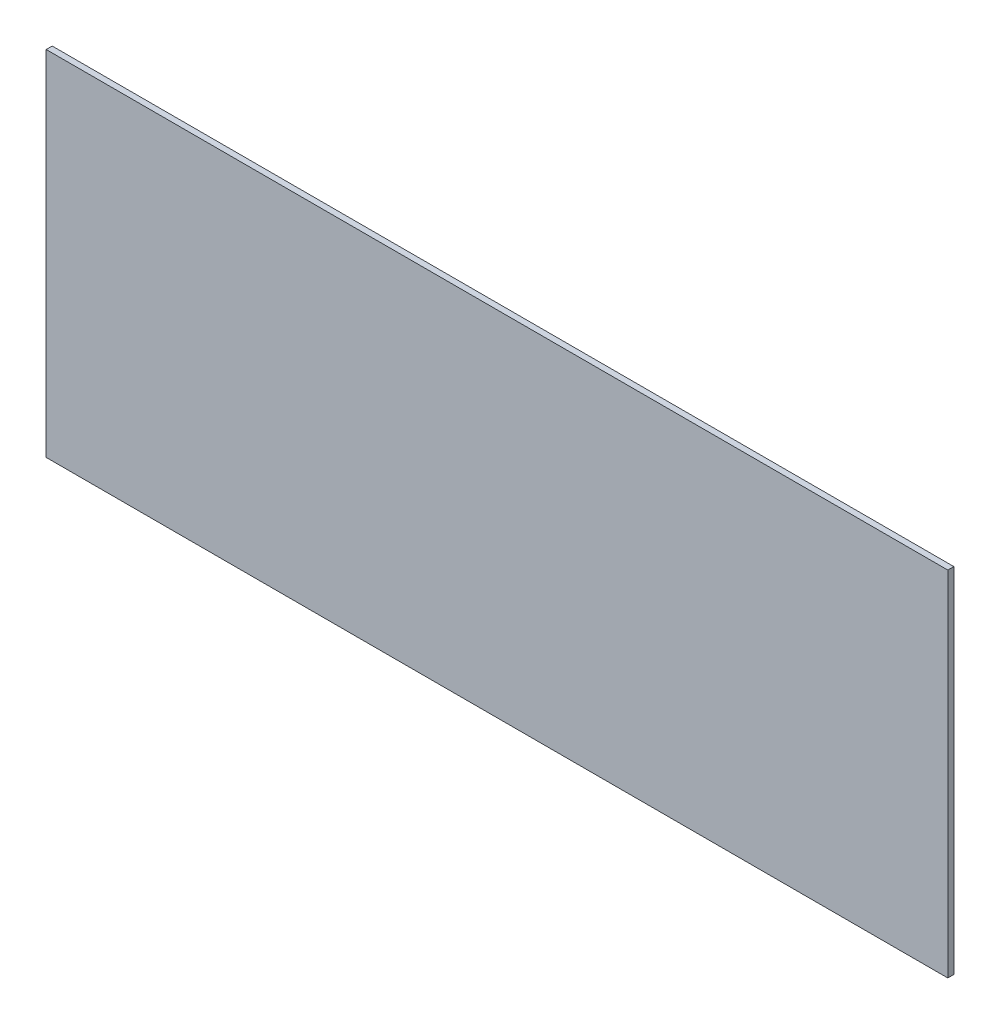
ISO-10303-21;
HEADER;
FILE_DESCRIPTION(('STEP AP214'),'2;1');
FILE_NAME('part.step','',(''),(''),'','','');
FILE_SCHEMA(('AUTOMOTIVE_DESIGN { 1 0 10303 214 1 1 1 1 }'));
ENDSEC;
DATA;
#1=APPLICATION_CONTEXT('core data for automotive mechanical design processes');
#2=APPLICATION_PROTOCOL_DEFINITION('international standard','automotive_design',2000,#1);
#3=PRODUCT_CONTEXT('',#1,'mechanical');
#4=PRODUCT('Part','Part','',(#3));
#5=PRODUCT_RELATED_PRODUCT_CATEGORY('part','',(#4));
#6=PRODUCT_DEFINITION_FORMATION('','',#4);
#7=PRODUCT_DEFINITION_CONTEXT('part definition',#1,'design');
#8=PRODUCT_DEFINITION('design','',#6,#7);
#9=PRODUCT_DEFINITION_SHAPE('','',#8);
#10=(LENGTH_UNIT() NAMED_UNIT(*) SI_UNIT(.MILLI.,.METRE.));
#11=(NAMED_UNIT(*) PLANE_ANGLE_UNIT() SI_UNIT($,.RADIAN.));
#12=(NAMED_UNIT(*) SI_UNIT($,.STERADIAN.) SOLID_ANGLE_UNIT());
#13=UNCERTAINTY_MEASURE_WITH_UNIT(LENGTH_MEASURE(1.E-05),#10,'distance_accuracy_value','');
#14=(GEOMETRIC_REPRESENTATION_CONTEXT(3) GLOBAL_UNCERTAINTY_ASSIGNED_CONTEXT((#13)) GLOBAL_UNIT_ASSIGNED_CONTEXT((#10,
#11,#12)) REPRESENTATION_CONTEXT('',''));
#15=CARTESIAN_POINT('',(0.,0.,0.));
#16=DIRECTION('',(0.,0.,1.));
#17=DIRECTION('',(1.,0.,0.));
#18=AXIS2_PLACEMENT_3D('',#15,#16,#17);
#19=CARTESIAN_POINT('',(373.5,-146.35,5.));
#20=DIRECTION('',(-1.,0.,0.));
#21=DIRECTION('',(0.,0.,1.));
#22=AXIS2_PLACEMENT_3D('',#19,#20,#21);
#23=PLANE('',#22);
#24=DIRECTION('',(0.,1.,0.));
#25=VECTOR('',#24,1.);
#26=CARTESIAN_POINT('',(373.5,-146.35,0.));
#27=LINE('',#26,#25);
#28=CARTESIAN_POINT('',(373.5,-146.35,0.));
#29=VERTEX_POINT('',#28);
#30=CARTESIAN_POINT('',(373.5,146.35,0.));
#31=VERTEX_POINT('',#30);
#32=EDGE_CURVE('E96',#29,#31,#27,.T.);
#33=ORIENTED_EDGE('',*,*,#32,.T.);
#34=DIRECTION('',(0.,0.,-1.));
#35=VECTOR('',#34,1.);
#36=CARTESIAN_POINT('',(373.5,146.35,5.));
#37=LINE('',#36,#35);
#38=CARTESIAN_POINT('',(373.5,146.35,5.));
#39=VERTEX_POINT('',#38);
#40=EDGE_CURVE('E11',#39,#31,#37,.T.);
#41=ORIENTED_EDGE('',*,*,#40,.F.);
#42=DIRECTION('',(0.,1.,0.));
#43=VECTOR('',#42,1.);
#44=CARTESIAN_POINT('',(373.5,-146.35,5.));
#45=LINE('',#44,#43);
#46=CARTESIAN_POINT('',(373.5,-146.35,5.));
#47=VERTEX_POINT('',#46);
#48=EDGE_CURVE('E84',#47,#39,#45,.T.);
#49=ORIENTED_EDGE('',*,*,#48,.F.);
#50=DIRECTION('',(0.,0.,-1.));
#51=VECTOR('',#50,1.);
#52=CARTESIAN_POINT('',(373.5,-146.35,5.));
#53=LINE('',#52,#51);
#54=EDGE_CURVE('E92',#47,#29,#53,.T.);
#55=ORIENTED_EDGE('',*,*,#54,.T.);
#56=EDGE_LOOP('',(#33,#41,#49,#55));
#57=FACE_BOUND('',#56,.T.);
#58=ADVANCED_FACE('F33',(#57),#23,.F.);
#59=CARTESIAN_POINT('',(-373.5,146.35,5.));
#60=DIRECTION('',(0.,-1.,0.));
#61=DIRECTION('',(0.,0.,-1.));
#62=AXIS2_PLACEMENT_3D('',#59,#60,#61);
#63=PLANE('',#62);
#64=DIRECTION('',(-1.,0.,0.));
#65=VECTOR('',#64,1.);
#66=CARTESIAN_POINT('',(-373.5,146.35,0.));
#67=LINE('',#66,#65);
#68=CARTESIAN_POINT('',(-373.5,146.35,0.));
#69=VERTEX_POINT('',#68);
#70=EDGE_CURVE('E88',#31,#69,#67,.T.);
#71=ORIENTED_EDGE('',*,*,#70,.T.);
#72=DIRECTION('',(0.,0.,-1.));
#73=VECTOR('',#72,1.);
#74=CARTESIAN_POINT('',(-373.5,146.35,5.));
#75=LINE('',#74,#73);
#76=CARTESIAN_POINT('',(-373.5,146.35,5.));
#77=VERTEX_POINT('',#76);
#78=EDGE_CURVE('E41',#77,#69,#75,.T.);
#79=ORIENTED_EDGE('',*,*,#78,.F.);
#80=DIRECTION('',(-1.,0.,0.));
#81=VECTOR('',#80,1.);
#82=CARTESIAN_POINT('',(-373.5,146.35,5.));
#83=LINE('',#82,#81);
#84=EDGE_CURVE('E79',#39,#77,#83,.T.);
#85=ORIENTED_EDGE('',*,*,#84,.F.);
#86=ORIENTED_EDGE('',*,*,#40,.T.);
#87=EDGE_LOOP('',(#71,#79,#85,#86));
#88=FACE_BOUND('',#87,.T.);
#89=ADVANCED_FACE('F87',(#88),#63,.F.);
#90=CARTESIAN_POINT('',(-373.5,-146.35,5.));
#91=DIRECTION('',(1.,0.,0.));
#92=DIRECTION('',(0.,0.,-1.));
#93=AXIS2_PLACEMENT_3D('',#90,#91,#92);
#94=PLANE('',#93);
#95=DIRECTION('',(0.,-1.,0.));
#96=VECTOR('',#95,1.);
#97=CARTESIAN_POINT('',(-373.5,-146.35,0.));
#98=LINE('',#97,#96);
#99=CARTESIAN_POINT('',(-373.5,-146.35,0.));
#100=VERTEX_POINT('',#99);
#101=EDGE_CURVE('E66',#69,#100,#98,.T.);
#102=ORIENTED_EDGE('',*,*,#101,.T.);
#103=DIRECTION('',(0.,0.,-1.));
#104=VECTOR('',#103,1.);
#105=CARTESIAN_POINT('',(-373.5,-146.35,5.));
#106=LINE('',#105,#104);
#107=CARTESIAN_POINT('',(-373.5,-146.35,5.));
#108=VERTEX_POINT('',#107);
#109=EDGE_CURVE('E89',#108,#100,#106,.T.);
#110=ORIENTED_EDGE('',*,*,#109,.F.);
#111=DIRECTION('',(0.,-1.,0.));
#112=VECTOR('',#111,1.);
#113=CARTESIAN_POINT('',(-373.5,-146.35,5.));
#114=LINE('',#113,#112);
#115=EDGE_CURVE('E82',#77,#108,#114,.T.);
#116=ORIENTED_EDGE('',*,*,#115,.F.);
#117=ORIENTED_EDGE('',*,*,#78,.T.);
#118=EDGE_LOOP('',(#102,#110,#116,#117));
#119=FACE_BOUND('',#118,.T.);
#120=ADVANCED_FACE('F90',(#119),#94,.F.);
#121=CARTESIAN_POINT('',(-373.5,-146.35,5.));
#122=DIRECTION('',(0.,1.,0.));
#123=DIRECTION('',(0.,0.,1.));
#124=AXIS2_PLACEMENT_3D('',#121,#122,#123);
#125=PLANE('',#124);
#126=DIRECTION('',(1.,0.,0.));
#127=VECTOR('',#126,1.);
#128=CARTESIAN_POINT('',(-373.5,-146.35,0.));
#129=LINE('',#128,#127);
#130=EDGE_CURVE('E72',#100,#29,#129,.T.);
#131=ORIENTED_EDGE('',*,*,#130,.T.);
#132=ORIENTED_EDGE('',*,*,#54,.F.);
#133=DIRECTION('',(1.,0.,0.));
#134=VECTOR('',#133,1.);
#135=CARTESIAN_POINT('',(-373.5,-146.35,5.));
#136=LINE('',#135,#134);
#137=EDGE_CURVE('E49',#108,#47,#136,.T.);
#138=ORIENTED_EDGE('',*,*,#137,.F.);
#139=ORIENTED_EDGE('',*,*,#109,.T.);
#140=EDGE_LOOP('',(#131,#132,#138,#139));
#141=FACE_BOUND('',#140,.T.);
#142=ADVANCED_FACE('F103',(#141),#125,.F.);
#143=CARTESIAN_POINT('',(0.,0.,5.));
#144=DIRECTION('',(0.,0.,-1.));
#145=DIRECTION('',(-1.,0.,0.));
#146=AXIS2_PLACEMENT_3D('',#143,#144,#145);
#147=PLANE('',#146);
#148=ORIENTED_EDGE('',*,*,#48,.T.);
#149=ORIENTED_EDGE('',*,*,#84,.T.);
#150=ORIENTED_EDGE('',*,*,#115,.T.);
#151=ORIENTED_EDGE('',*,*,#137,.T.);
#152=EDGE_LOOP('',(#148,#149,#150,#151));
#153=FACE_BOUND('',#152,.T.);
#154=ADVANCED_FACE('F80',(#153),#147,.F.);
#155=CARTESIAN_POINT('',(0.,0.,0.));
#156=DIRECTION('',(0.,0.,-1.));
#157=DIRECTION('',(-1.,0.,0.));
#158=AXIS2_PLACEMENT_3D('',#155,#156,#157);
#159=PLANE('',#158);
#160=ORIENTED_EDGE('',*,*,#32,.F.);
#161=ORIENTED_EDGE('',*,*,#130,.F.);
#162=ORIENTED_EDGE('',*,*,#101,.F.);
#163=ORIENTED_EDGE('',*,*,#70,.F.);
#164=EDGE_LOOP('',(#160,#161,#162,#163));
#165=FACE_BOUND('',#164,.T.);
#166=ADVANCED_FACE('F106',(#165),#159,.T.);
#167=CLOSED_SHELL('',(#58,#89,#120,#142,#154,#166));
#168=MANIFOLD_SOLID_BREP('B2',#167);
#169=ADVANCED_BREP_SHAPE_REPRESENTATION('',(#18,#168),#14);
#170=SHAPE_DEFINITION_REPRESENTATION(#9,#169);
ENDSEC;
END-ISO-10303-21;
